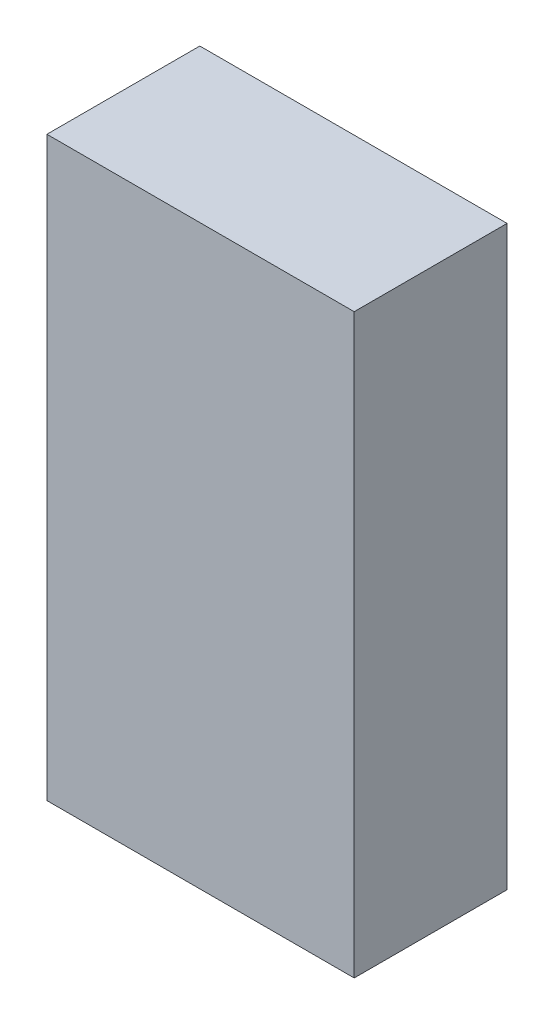
ISO-10303-21;
HEADER;
FILE_DESCRIPTION(('STEP AP214'),'2;1');
FILE_NAME('part.step','',(''),(''),'','','');
FILE_SCHEMA(('AUTOMOTIVE_DESIGN { 1 0 10303 214 1 1 1 1 }'));
ENDSEC;
DATA;
#1=APPLICATION_CONTEXT('core data for automotive mechanical design processes');
#2=APPLICATION_PROTOCOL_DEFINITION('international standard','automotive_design',2000,#1);
#3=PRODUCT_CONTEXT('',#1,'mechanical');
#4=PRODUCT('Part','Part','',(#3));
#5=PRODUCT_RELATED_PRODUCT_CATEGORY('part','',(#4));
#6=PRODUCT_DEFINITION_FORMATION('','',#4);
#7=PRODUCT_DEFINITION_CONTEXT('part definition',#1,'design');
#8=PRODUCT_DEFINITION('design','',#6,#7);
#9=PRODUCT_DEFINITION_SHAPE('','',#8);
#10=(LENGTH_UNIT() NAMED_UNIT(*) SI_UNIT(.MILLI.,.METRE.));
#11=(NAMED_UNIT(*) PLANE_ANGLE_UNIT() SI_UNIT($,.RADIAN.));
#12=(NAMED_UNIT(*) SI_UNIT($,.STERADIAN.) SOLID_ANGLE_UNIT());
#13=UNCERTAINTY_MEASURE_WITH_UNIT(LENGTH_MEASURE(1.E-05),#10,'distance_accuracy_value','');
#14=(GEOMETRIC_REPRESENTATION_CONTEXT(3) GLOBAL_UNCERTAINTY_ASSIGNED_CONTEXT((#13)) GLOBAL_UNIT_ASSIGNED_CONTEXT((#10,
#11,#12)) REPRESENTATION_CONTEXT('',''));
#15=CARTESIAN_POINT('',(0.,0.,0.));
#16=DIRECTION('',(0.,0.,1.));
#17=DIRECTION('',(1.,0.,0.));
#18=AXIS2_PLACEMENT_3D('',#15,#16,#17);
#19=CARTESIAN_POINT('',(-25.3,-38.5,-30.3));
#20=DIRECTION('',(0.,0.,-1.));
#21=DIRECTION('',(-1.,0.,0.));
#22=AXIS2_PLACEMENT_3D('',#19,#20,#21);
#23=PLANE('',#22);
#24=DIRECTION('',(0.,-1.,0.));
#25=VECTOR('',#24,1.);
#26=CARTESIAN_POINT('',(-66.3,-38.5,-30.3));
#27=LINE('',#26,#25);
#28=CARTESIAN_POINT('',(-66.3,38.5,-30.3));
#29=VERTEX_POINT('',#28);
#30=CARTESIAN_POINT('',(-66.3,-38.5,-30.3));
#31=VERTEX_POINT('',#30);
#32=EDGE_CURVE('E100',#29,#31,#27,.T.);
#33=ORIENTED_EDGE('',*,*,#32,.T.);
#34=DIRECTION('',(-1.,0.,0.));
#35=VECTOR('',#34,1.);
#36=CARTESIAN_POINT('',(-25.3,-38.5,-30.3));
#37=LINE('',#36,#35);
#38=CARTESIAN_POINT('',(-25.3,-38.5,-30.3));
#39=VERTEX_POINT('',#38);
#40=EDGE_CURVE('E11',#39,#31,#37,.T.);
#41=ORIENTED_EDGE('',*,*,#40,.F.);
#42=DIRECTION('',(0.,-1.,0.));
#43=VECTOR('',#42,1.);
#44=CARTESIAN_POINT('',(-25.3,-38.5,-30.3));
#45=LINE('',#44,#43);
#46=CARTESIAN_POINT('',(-25.3,38.5,-30.3));
#47=VERTEX_POINT('',#46);
#48=EDGE_CURVE('E88',#47,#39,#45,.T.);
#49=ORIENTED_EDGE('',*,*,#48,.F.);
#50=DIRECTION('',(-1.,0.,0.));
#51=VECTOR('',#50,1.);
#52=CARTESIAN_POINT('',(-25.3,38.5,-30.3));
#53=LINE('',#52,#51);
#54=EDGE_CURVE('E96',#47,#29,#53,.T.);
#55=ORIENTED_EDGE('',*,*,#54,.T.);
#56=EDGE_LOOP('',(#33,#41,#49,#55));
#57=FACE_BOUND('',#56,.T.);
#58=ADVANCED_FACE('F37',(#57),#23,.F.);
#59=CARTESIAN_POINT('',(-25.3,-38.5,-30.3));
#60=DIRECTION('',(0.,1.,0.));
#61=DIRECTION('',(0.,0.,1.));
#62=AXIS2_PLACEMENT_3D('',#59,#60,#61);
#63=PLANE('',#62);
#64=DIRECTION('',(0.,0.,-1.));
#65=VECTOR('',#64,1.);
#66=CARTESIAN_POINT('',(-66.3,-38.5,-30.3));
#67=LINE('',#66,#65);
#68=CARTESIAN_POINT('',(-66.3,-38.5,-50.7));
#69=VERTEX_POINT('',#68);
#70=EDGE_CURVE('E92',#31,#69,#67,.T.);
#71=ORIENTED_EDGE('',*,*,#70,.T.);
#72=DIRECTION('',(-1.,0.,0.));
#73=VECTOR('',#72,1.);
#74=CARTESIAN_POINT('',(-25.3,-38.5,-50.7));
#75=LINE('',#74,#73);
#76=CARTESIAN_POINT('',(-25.3,-38.5,-50.7));
#77=VERTEX_POINT('',#76);
#78=EDGE_CURVE('E45',#77,#69,#75,.T.);
#79=ORIENTED_EDGE('',*,*,#78,.F.);
#80=DIRECTION('',(0.,0.,-1.));
#81=VECTOR('',#80,1.);
#82=CARTESIAN_POINT('',(-25.3,-38.5,-30.3));
#83=LINE('',#82,#81);
#84=EDGE_CURVE('E83',#39,#77,#83,.T.);
#85=ORIENTED_EDGE('',*,*,#84,.F.);
#86=ORIENTED_EDGE('',*,*,#40,.T.);
#87=EDGE_LOOP('',(#71,#79,#85,#86));
#88=FACE_BOUND('',#87,.T.);
#89=ADVANCED_FACE('F91',(#88),#63,.F.);
#90=CARTESIAN_POINT('',(-25.3,-38.5,-50.7));
#91=DIRECTION('',(0.,0.,1.));
#92=DIRECTION('',(1.,0.,0.));
#93=AXIS2_PLACEMENT_3D('',#90,#91,#92);
#94=PLANE('',#93);
#95=DIRECTION('',(0.,1.,0.));
#96=VECTOR('',#95,1.);
#97=CARTESIAN_POINT('',(-66.3,-38.5,-50.7));
#98=LINE('',#97,#96);
#99=CARTESIAN_POINT('',(-66.3,38.5,-50.7));
#100=VERTEX_POINT('',#99);
#101=EDGE_CURVE('E70',#69,#100,#98,.T.);
#102=ORIENTED_EDGE('',*,*,#101,.T.);
#103=DIRECTION('',(-1.,0.,0.));
#104=VECTOR('',#103,1.);
#105=CARTESIAN_POINT('',(-25.3,38.5,-50.7));
#106=LINE('',#105,#104);
#107=CARTESIAN_POINT('',(-25.3,38.5,-50.7));
#108=VERTEX_POINT('',#107);
#109=EDGE_CURVE('E93',#108,#100,#106,.T.);
#110=ORIENTED_EDGE('',*,*,#109,.F.);
#111=DIRECTION('',(0.,1.,0.));
#112=VECTOR('',#111,1.);
#113=CARTESIAN_POINT('',(-25.3,-38.5,-50.7));
#114=LINE('',#113,#112);
#115=EDGE_CURVE('E86',#77,#108,#114,.T.);
#116=ORIENTED_EDGE('',*,*,#115,.F.);
#117=ORIENTED_EDGE('',*,*,#78,.T.);
#118=EDGE_LOOP('',(#102,#110,#116,#117));
#119=FACE_BOUND('',#118,.T.);
#120=ADVANCED_FACE('F94',(#119),#94,.F.);
#121=CARTESIAN_POINT('',(-25.3,38.5,-30.3));
#122=DIRECTION('',(0.,-1.,0.));
#123=DIRECTION('',(0.,0.,-1.));
#124=AXIS2_PLACEMENT_3D('',#121,#122,#123);
#125=PLANE('',#124);
#126=DIRECTION('',(0.,0.,1.));
#127=VECTOR('',#126,1.);
#128=CARTESIAN_POINT('',(-66.3,38.5,-30.3));
#129=LINE('',#128,#127);
#130=EDGE_CURVE('E76',#100,#29,#129,.T.);
#131=ORIENTED_EDGE('',*,*,#130,.T.);
#132=ORIENTED_EDGE('',*,*,#54,.F.);
#133=DIRECTION('',(0.,0.,1.));
#134=VECTOR('',#133,1.);
#135=CARTESIAN_POINT('',(-25.3,38.5,-30.3));
#136=LINE('',#135,#134);
#137=EDGE_CURVE('E53',#108,#47,#136,.T.);
#138=ORIENTED_EDGE('',*,*,#137,.F.);
#139=ORIENTED_EDGE('',*,*,#109,.T.);
#140=EDGE_LOOP('',(#131,#132,#138,#139));
#141=FACE_BOUND('',#140,.T.);
#142=ADVANCED_FACE('F107',(#141),#125,.F.);
#143=CARTESIAN_POINT('',(-25.3,0.,0.));
#144=DIRECTION('',(-1.,0.,0.));
#145=DIRECTION('',(0.,0.,1.));
#146=AXIS2_PLACEMENT_3D('',#143,#144,#145);
#147=PLANE('',#146);
#148=ORIENTED_EDGE('',*,*,#48,.T.);
#149=ORIENTED_EDGE('',*,*,#84,.T.);
#150=ORIENTED_EDGE('',*,*,#115,.T.);
#151=ORIENTED_EDGE('',*,*,#137,.T.);
#152=EDGE_LOOP('',(#148,#149,#150,#151));
#153=FACE_BOUND('',#152,.T.);
#154=ADVANCED_FACE('F84',(#153),#147,.F.);
#155=CARTESIAN_POINT('',(-66.3,0.,0.));
#156=DIRECTION('',(-1.,0.,0.));
#157=DIRECTION('',(0.,0.,1.));
#158=AXIS2_PLACEMENT_3D('',#155,#156,#157);
#159=PLANE('',#158);
#160=ORIENTED_EDGE('',*,*,#32,.F.);
#161=ORIENTED_EDGE('',*,*,#130,.F.);
#162=ORIENTED_EDGE('',*,*,#101,.F.);
#163=ORIENTED_EDGE('',*,*,#70,.F.);
#164=EDGE_LOOP('',(#160,#161,#162,#163));
#165=FACE_BOUND('',#164,.T.);
#166=ADVANCED_FACE('F110',(#165),#159,.T.);
#167=CLOSED_SHELL('',(#58,#89,#120,#142,#154,#166));
#168=MANIFOLD_SOLID_BREP('B2',#167);
#169=ADVANCED_BREP_SHAPE_REPRESENTATION('',(#18,#168),#14);
#170=SHAPE_DEFINITION_REPRESENTATION(#9,#169);
ENDSEC;
END-ISO-10303-21;
